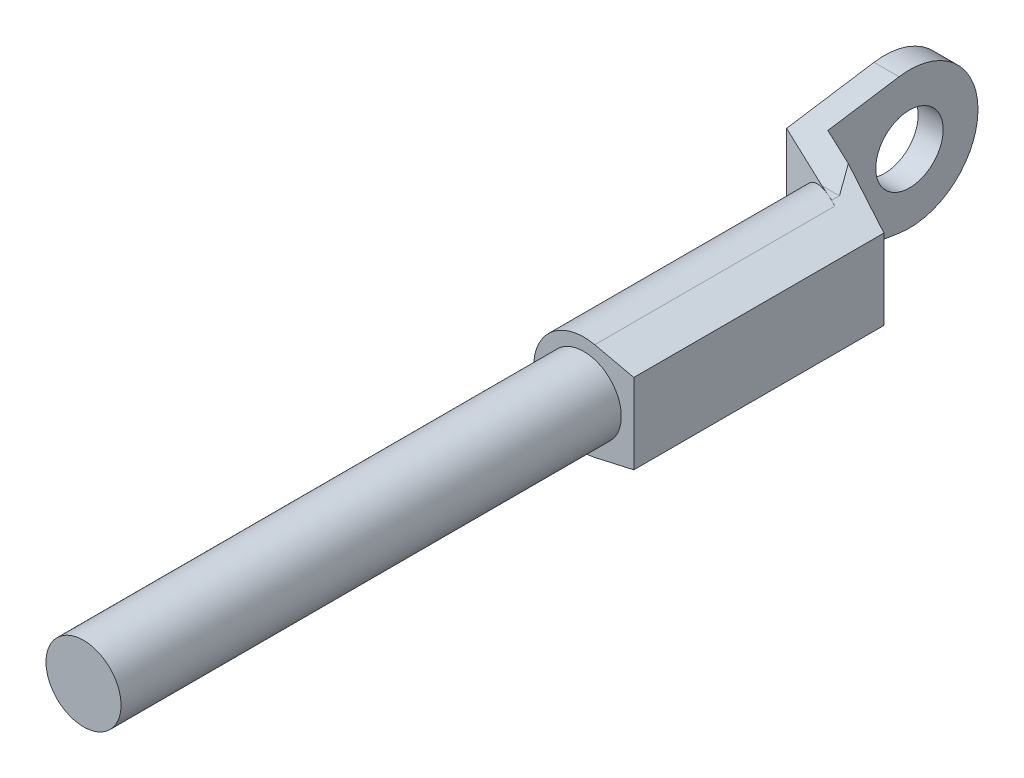
ISO-10303-21;
HEADER;
FILE_DESCRIPTION(('STEP AP214'),'2;1');
FILE_NAME('part.step','',(''),(''),'','','');
FILE_SCHEMA(('AUTOMOTIVE_DESIGN { 1 0 10303 214 1 1 1 1 }'));
ENDSEC;
DATA;
#1=APPLICATION_CONTEXT('core data for automotive mechanical design processes');
#2=APPLICATION_PROTOCOL_DEFINITION('international standard','automotive_design',2000,#1);
#3=PRODUCT_CONTEXT('',#1,'mechanical');
#4=PRODUCT('Part','Part','',(#3));
#5=PRODUCT_RELATED_PRODUCT_CATEGORY('part','',(#4));
#6=PRODUCT_DEFINITION_FORMATION('','',#4);
#7=PRODUCT_DEFINITION_CONTEXT('part definition',#1,'design');
#8=PRODUCT_DEFINITION('design','',#6,#7);
#9=PRODUCT_DEFINITION_SHAPE('','',#8);
#10=(LENGTH_UNIT() NAMED_UNIT(*) SI_UNIT(.MILLI.,.METRE.));
#11=(NAMED_UNIT(*) PLANE_ANGLE_UNIT() SI_UNIT($,.RADIAN.));
#12=(NAMED_UNIT(*) SI_UNIT($,.STERADIAN.) SOLID_ANGLE_UNIT());
#13=UNCERTAINTY_MEASURE_WITH_UNIT(LENGTH_MEASURE(1.E-05),#10,'distance_accuracy_value','');
#14=(GEOMETRIC_REPRESENTATION_CONTEXT(3) GLOBAL_UNCERTAINTY_ASSIGNED_CONTEXT((#13)) GLOBAL_UNIT_ASSIGNED_CONTEXT((#10,
#11,#12)) REPRESENTATION_CONTEXT('',''));
#15=CARTESIAN_POINT('',(0.,0.,0.));
#16=DIRECTION('',(0.,0.,1.));
#17=DIRECTION('',(1.,0.,0.));
#18=AXIS2_PLACEMENT_3D('',#15,#16,#17);
#19=CARTESIAN_POINT('',(501.65,38.1,0.));
#20=DIRECTION('',(-1.,0.,0.));
#21=DIRECTION('',(0.,0.,1.));
#22=AXIS2_PLACEMENT_3D('',#19,#20,#21);
#23=CYLINDRICAL_SURFACE('',#22,8.5598);
#24=CARTESIAN_POINT('',(476.25,38.1,0.));
#25=DIRECTION('',(-1.,0.,0.));
#26=DIRECTION('',(0.,0.,1.));
#27=AXIS2_PLACEMENT_3D('',#24,#25,#26);
#28=CIRCLE('',#27,8.5598);
#29=CARTESIAN_POINT('',(476.25,38.1,8.5598));
#30=VERTEX_POINT('',#29);
#31=EDGE_CURVE('E160',#30,#30,#28,.F.);
#32=ORIENTED_EDGE('',*,*,#31,.T.);
#33=EDGE_LOOP('',(#32));
#34=FACE_BOUND('',#33,.T.);
#35=CARTESIAN_POINT('',(469.9,38.1,0.));
#36=DIRECTION('',(-1.,0.,0.));
#37=DIRECTION('',(0.,0.,1.));
#38=AXIS2_PLACEMENT_3D('',#35,#36,#37);
#39=CIRCLE('',#38,8.5598);
#40=CARTESIAN_POINT('',(469.9,38.1,8.5598));
#41=VERTEX_POINT('',#40);
#42=EDGE_CURVE('E164',#41,#41,#39,.F.);
#43=ORIENTED_EDGE('',*,*,#42,.F.);
#44=EDGE_LOOP('',(#43));
#45=FACE_BOUND('',#44,.T.);
#46=ADVANCED_FACE('F17',(#34,#45),#23,.F.);
#47=CARTESIAN_POINT('',(469.9,38.1,0.));
#48=DIRECTION('',(-1.,0.,0.));
#49=DIRECTION('',(0.,0.,1.));
#50=AXIS2_PLACEMENT_3D('',#47,#48,#49);
#51=PLANE('',#50);
#52=CARTESIAN_POINT('',(469.9,38.1,0.));
#53=DIRECTION('',(1.,0.,0.));
#54=DIRECTION('',(0.,0.,-1.));
#55=AXIS2_PLACEMENT_3D('',#52,#53,#54);
#56=CIRCLE('',#55,17.399);
#57=CARTESIAN_POINT('',(469.9,20.903280810629,2.64538279307929));
#58=VERTEX_POINT('',#57);
#59=CARTESIAN_POINT('',(469.9,55.296719189371,2.64538279307928));
#60=VERTEX_POINT('',#59);
#61=EDGE_CURVE('E102',#58,#60,#56,.T.);
#62=ORIENTED_EDGE('',*,*,#61,.F.);
#63=DIRECTION('',(0.,0.152042231914437,0.988373997894763));
#64=VECTOR('',#63,1.);
#65=CARTESIAN_POINT('',(469.9,20.903280810629,2.64538279307929));
#66=LINE('',#65,#64);
#67=CARTESIAN_POINT('',(469.9,24.3181861600818,24.8445021441437));
#68=VERTEX_POINT('',#67);
#69=EDGE_CURVE('E98',#58,#68,#66,.T.);
#70=ORIENTED_EDGE('',*,*,#69,.T.);
#71=DIRECTION('',(0.,1.,0.));
#72=VECTOR('',#71,1.);
#73=CARTESIAN_POINT('',(469.9,38.1,24.8445021441437));
#74=LINE('',#73,#72);
#75=CARTESIAN_POINT('',(469.9,51.8818138399182,24.8445021441438));
#76=VERTEX_POINT('',#75);
#77=EDGE_CURVE('E78',#68,#76,#74,.T.);
#78=ORIENTED_EDGE('',*,*,#77,.T.);
#79=DIRECTION('',(0.,0.152042231914437,-0.988373997894763));
#80=VECTOR('',#79,1.);
#81=CARTESIAN_POINT('',(469.9,50.8,31.877));
#82=LINE('',#81,#80);
#83=EDGE_CURVE('E73',#76,#60,#82,.T.);
#84=ORIENTED_EDGE('',*,*,#83,.T.);
#85=EDGE_LOOP('',(#62,#70,#78,#84));
#86=FACE_BOUND('',#85,.T.);
#87=ORIENTED_EDGE('',*,*,#42,.T.);
#88=EDGE_LOOP('',(#87));
#89=FACE_BOUND('',#88,.T.);
#90=ADVANCED_FACE('F100',(#86,#89),#51,.T.);
#91=CARTESIAN_POINT('',(469.9,38.1,0.));
#92=DIRECTION('',(1.,0.,0.));
#93=DIRECTION('',(0.,0.,-1.));
#94=AXIS2_PLACEMENT_3D('',#91,#92,#93);
#95=CYLINDRICAL_SURFACE('',#94,17.399);
#96=DIRECTION('',(1.,0.,0.));
#97=VECTOR('',#96,1.);
#98=CARTESIAN_POINT('',(469.9,55.296719189371,2.64538279307928));
#99=LINE('',#98,#97);
#100=CARTESIAN_POINT('',(476.25,55.296719189371,2.64538279307928));
#101=VERTEX_POINT('',#100);
#102=EDGE_CURVE('E429',#60,#101,#99,.T.);
#103=ORIENTED_EDGE('',*,*,#102,.T.);
#104=CARTESIAN_POINT('',(476.25,38.1,0.));
#105=DIRECTION('',(1.,0.,0.));
#106=DIRECTION('',(0.,0.,-1.));
#107=AXIS2_PLACEMENT_3D('',#104,#105,#106);
#108=CIRCLE('',#107,17.399);
#109=CARTESIAN_POINT('',(476.25,20.903280810629,2.64538279307929));
#110=VERTEX_POINT('',#109);
#111=EDGE_CURVE('E135',#101,#110,#108,.F.);
#112=ORIENTED_EDGE('',*,*,#111,.T.);
#113=DIRECTION('',(1.,0.,0.));
#114=VECTOR('',#113,1.);
#115=CARTESIAN_POINT('',(469.9,20.903280810629,2.64538279307929));
#116=LINE('',#115,#114);
#117=EDGE_CURVE('E107',#110,#58,#116,.F.);
#118=ORIENTED_EDGE('',*,*,#117,.T.);
#119=ORIENTED_EDGE('',*,*,#61,.T.);
#120=EDGE_LOOP('',(#103,#112,#118,#119));
#121=FACE_BOUND('',#120,.T.);
#122=ADVANCED_FACE('F248',(#121),#95,.T.);
#123=CARTESIAN_POINT('',(476.25,12.7,-17.399));
#124=DIRECTION('',(-1.,0.,0.));
#125=DIRECTION('',(0.,0.,1.));
#126=AXIS2_PLACEMENT_3D('',#123,#124,#125);
#127=PLANE('',#126);
#128=DIRECTION('',(0.,0.152042231914437,-0.988373997894763));
#129=VECTOR('',#128,1.);
#130=CARTESIAN_POINT('',(476.25,50.8,31.877));
#131=LINE('',#130,#129);
#132=CARTESIAN_POINT('',(476.25,52.5192115408693,20.701));
#133=VERTEX_POINT('',#132);
#134=EDGE_CURVE('E432',#101,#133,#131,.F.);
#135=ORIENTED_EDGE('',*,*,#134,.T.);
#136=DIRECTION('',(0.,1.,0.));
#137=VECTOR('',#136,1.);
#138=CARTESIAN_POINT('',(476.25,12.7,20.701));
#139=LINE('',#138,#137);
#140=CARTESIAN_POINT('',(476.25,23.6807884591308,20.701));
#141=VERTEX_POINT('',#140);
#142=EDGE_CURVE('E122',#133,#141,#139,.F.);
#143=ORIENTED_EDGE('',*,*,#142,.T.);
#144=DIRECTION('',(0.,0.152042231914437,0.988373997894763));
#145=VECTOR('',#144,1.);
#146=CARTESIAN_POINT('',(476.25,20.903280810629,2.64538279307929));
#147=LINE('',#146,#145);
#148=EDGE_CURVE('E132',#141,#110,#147,.F.);
#149=ORIENTED_EDGE('',*,*,#148,.T.);
#150=ORIENTED_EDGE('',*,*,#111,.F.);
#151=EDGE_LOOP('',(#135,#143,#149,#150));
#152=FACE_BOUND('',#151,.T.);
#153=ORIENTED_EDGE('',*,*,#31,.F.);
#154=EDGE_LOOP('',(#153));
#155=FACE_BOUND('',#154,.T.);
#156=ADVANCED_FACE('F244',(#152,#155),#127,.F.);
#157=CARTESIAN_POINT('',(469.9,25.4,31.877));
#158=DIRECTION('',(0.,1.,0.));
#159=DIRECTION('',(0.,0.,1.));
#160=AXIS2_PLACEMENT_3D('',#157,#158,#159);
#161=PLANE('',#160);
#162=DIRECTION('',(0.,0.,1.));
#163=VECTOR('',#162,1.);
#164=CARTESIAN_POINT('',(490.361111111111,25.4,-17.9483393567897));
#165=LINE('',#164,#163);
#166=CARTESIAN_POINT('',(490.361111111111,25.4,33.8473910330326));
#167=VERTEX_POINT('',#166);
#168=CARTESIAN_POINT('',(490.361111111111,25.4,31.877));
#169=VERTEX_POINT('',#168);
#170=EDGE_CURVE('E524',#167,#169,#165,.F.);
#171=ORIENTED_EDGE('',*,*,#170,.F.);
#172=DIRECTION('',(-0.915315032422766,0.,-0.402738614266016));
#173=VECTOR('',#172,1.);
#174=CARTESIAN_POINT('',(487.341704973674,25.4,32.5188523325602));
#175=LINE('',#174,#173);
#176=CARTESIAN_POINT('',(488.95,25.4,33.2265021441437));
#177=VERTEX_POINT('',#176);
#178=EDGE_CURVE('E519',#167,#177,#175,.T.);
#179=ORIENTED_EDGE('',*,*,#178,.T.);
#180=DIRECTION('',(-0.915315032422766,0.,-0.402738614266016));
#181=VECTOR('',#180,1.);
#182=CARTESIAN_POINT('',(487.341704973674,25.4,32.5188523325602));
#183=LINE('',#182,#181);
#184=CARTESIAN_POINT('',(485.882949672401,25.4,31.8770000000001));
#185=VERTEX_POINT('',#184);
#186=EDGE_CURVE('E116',#177,#185,#183,.T.);
#187=ORIENTED_EDGE('',*,*,#186,.T.);
#188=DIRECTION('',(1.,0.,0.));
#189=VECTOR('',#188,1.);
#190=CARTESIAN_POINT('',(469.9,25.4,31.877));
#191=LINE('',#190,#189);
#192=EDGE_CURVE('E106',#185,#169,#191,.T.);
#193=ORIENTED_EDGE('',*,*,#192,.T.);
#194=EDGE_LOOP('',(#171,#179,#187,#193));
#195=FACE_BOUND('',#194,.T.);
#196=ADVANCED_FACE('F241',(#195),#161,.F.);
#197=CARTESIAN_POINT('',(469.9,20.903280810629,2.64538279307929));
#198=DIRECTION('',(0.,0.988373997894763,-0.152042231914437));
#199=DIRECTION('',(0.,0.152042231914437,0.988373997894763));
#200=AXIS2_PLACEMENT_3D('',#197,#198,#199);
#201=PLANE('',#200);
#202=DIRECTION('',(-0.55989585254643,-0.125976566822947,-0.818930118455054));
#203=VECTOR('',#202,1.);
#204=CARTESIAN_POINT('',(490.361111111111,25.4,31.877));
#205=LINE('',#204,#203);
#206=CARTESIAN_POINT('',(485.504000115403,24.3071500259656,24.7727600507772));
#207=VERTEX_POINT('',#206);
#208=EDGE_CURVE('E533',#169,#207,#205,.T.);
#209=ORIENTED_EDGE('',*,*,#208,.F.);
#210=ORIENTED_EDGE('',*,*,#192,.F.);
#211=DIRECTION('',(-0.913563472538673,-0.061834994697046,-0.401967927917015));
#212=VECTOR('',#211,1.);
#213=CARTESIAN_POINT('',(485.882949672401,25.4,31.8770000000001));
#214=LINE('',#213,#212);
#215=EDGE_CURVE('E111',#185,#68,#214,.T.);
#216=ORIENTED_EDGE('',*,*,#215,.T.);
#217=ORIENTED_EDGE('',*,*,#69,.F.);
#218=ORIENTED_EDGE('',*,*,#117,.F.);
#219=ORIENTED_EDGE('',*,*,#148,.F.);
#220=DIRECTION('',(0.913563472538673,0.0618349946970416,0.401967927917015));
#221=VECTOR('',#220,1.);
#222=CARTESIAN_POINT('',(476.25,23.6807884591308,20.701));
#223=LINE('',#222,#221);
#224=EDGE_CURVE('E124',#141,#207,#223,.T.);
#225=ORIENTED_EDGE('',*,*,#224,.T.);
#226=EDGE_LOOP('',(#209,#210,#216,#217,#218,#219,#225));
#227=FACE_BOUND('',#226,.T.);
#228=ADVANCED_FACE('F113',(#227),#201,.F.);
#229=CARTESIAN_POINT('',(487.341704973674,38.1,32.5188523325602));
#230=DIRECTION('',(0.402738614266016,0.,-0.915315032422766));
#231=DIRECTION('',(-0.915315032422766,0.,-0.402738614266016));
#232=AXIS2_PLACEMENT_3D('',#229,#230,#231);
#233=PLANE('',#232);
#234=DIRECTION('',(-0.896500504615088,-0.201712613538394,-0.394460222030565));
#235=VECTOR('',#234,1.);
#236=CARTESIAN_POINT('',(491.737804878049,25.709756097561,34.4531362904853));
#237=LINE('',#236,#235);
#238=CARTESIAN_POINT('',(491.737804878049,25.709756097561,34.4531362904852));
#239=VERTEX_POINT('',#238);
#240=EDGE_CURVE('E509',#239,#167,#237,.T.);
#241=ORIENTED_EDGE('',*,*,#240,.F.);
#242=CARTESIAN_POINT('',(488.95,38.1,33.2265021441436));
#243=DIRECTION('',(0.402738614266016,0.,-0.915315032422766));
#244=DIRECTION('',(0.915315032422766,0.,0.402738614266016));
#245=AXIS2_PLACEMENT_3D('',#242,#243,#244);
#246=ELLIPSE('',#245,13.8750042882876,12.7);
#247=EDGE_CURVE('E155',#177,#239,#246,.F.);
#248=ORIENTED_EDGE('',*,*,#247,.F.);
#249=ORIENTED_EDGE('',*,*,#178,.F.);
#250=EDGE_LOOP('',(#241,#248,#249));
#251=FACE_BOUND('',#250,.T.);
#252=ADVANCED_FACE('F234',(#251),#233,.F.);
#253=CARTESIAN_POINT('',(487.341704973674,38.1,32.5188523325602));
#254=DIRECTION('',(0.402738614266016,0.,-0.915315032422766));
#255=DIRECTION('',(-0.915315032422766,0.,-0.402738614266016));
#256=AXIS2_PLACEMENT_3D('',#253,#254,#255);
#257=PLANE('',#256);
#258=DIRECTION('',(0.89650050461507,-0.201712613538356,0.394460222030625));
#259=VECTOR('',#258,1.);
#260=CARTESIAN_POINT('',(490.361111111111,50.8,33.8473910330325));
#261=LINE('',#260,#259);
#262=CARTESIAN_POINT('',(490.361111111111,50.8,33.8473910330326));
#263=VERTEX_POINT('',#262);
#264=CARTESIAN_POINT('',(491.737804878049,50.4902439024391,34.4531362904851));
#265=VERTEX_POINT('',#264);
#266=EDGE_CURVE('E515',#263,#265,#261,.T.);
#267=ORIENTED_EDGE('',*,*,#266,.F.);
#268=DIRECTION('',(-0.915315032422754,0.,-0.402738614266042));
#269=VECTOR('',#268,1.);
#270=CARTESIAN_POINT('',(490.361111111111,50.8,33.8473910330327));
#271=LINE('',#270,#269);
#272=CARTESIAN_POINT('',(488.95,50.8,33.2265021441437));
#273=VERTEX_POINT('',#272);
#274=EDGE_CURVE('E462',#263,#273,#271,.T.);
#275=ORIENTED_EDGE('',*,*,#274,.T.);
#276=CARTESIAN_POINT('',(488.95,38.1,33.2265021441436));
#277=DIRECTION('',(0.402738614266016,0.,-0.915315032422766));
#278=DIRECTION('',(0.915315032422766,0.,0.402738614266016));
#279=AXIS2_PLACEMENT_3D('',#276,#277,#278);
#280=ELLIPSE('',#279,13.8750042882876,12.7);
#281=EDGE_CURVE('E151',#265,#273,#280,.F.);
#282=ORIENTED_EDGE('',*,*,#281,.F.);
#283=EDGE_LOOP('',(#267,#275,#282));
#284=FACE_BOUND('',#283,.T.);
#285=ADVANCED_FACE('F231',(#284),#257,.F.);
#286=CARTESIAN_POINT('',(487.341704973674,38.1,32.5188523325602));
#287=DIRECTION('',(0.402738614266016,0.,-0.915315032422766));
#288=DIRECTION('',(-0.915315032422766,0.,-0.402738614266016));
#289=AXIS2_PLACEMENT_3D('',#286,#287,#288);
#290=PLANE('',#289);
#291=ORIENTED_EDGE('',*,*,#77,.F.);
#292=ORIENTED_EDGE('',*,*,#215,.F.);
#293=ORIENTED_EDGE('',*,*,#186,.F.);
#294=CARTESIAN_POINT('',(488.95,38.1,33.2265021441436));
#295=DIRECTION('',(0.402738614266016,0.,-0.915315032422766));
#296=DIRECTION('',(0.915315032422766,0.,0.402738614266016));
#297=AXIS2_PLACEMENT_3D('',#294,#295,#296);
#298=ELLIPSE('',#297,13.8750042882876,12.7);
#299=EDGE_CURVE('E148',#273,#177,#298,.F.);
#300=ORIENTED_EDGE('',*,*,#299,.F.);
#301=DIRECTION('',(-0.915315032422741,0.,-0.402738614266074));
#302=VECTOR('',#301,1.);
#303=CARTESIAN_POINT('',(488.95,50.8,33.2265021441438));
#304=LINE('',#303,#302);
#305=CARTESIAN_POINT('',(485.882949672401,50.8,31.877));
#306=VERTEX_POINT('',#305);
#307=EDGE_CURVE('E442',#273,#306,#304,.T.);
#308=ORIENTED_EDGE('',*,*,#307,.T.);
#309=DIRECTION('',(-0.913563472538677,0.0618349946970481,-0.401967927917004));
#310=VECTOR('',#309,1.);
#311=CARTESIAN_POINT('',(485.882949672401,50.8,31.877));
#312=LINE('',#311,#310);
#313=EDGE_CURVE('E121',#306,#76,#312,.T.);
#314=ORIENTED_EDGE('',*,*,#313,.T.);
#315=EDGE_LOOP('',(#291,#292,#293,#300,#308,#314));
#316=FACE_BOUND('',#315,.T.);
#317=ADVANCED_FACE('F118',(#316),#290,.F.);
#318=CARTESIAN_POINT('',(476.25,12.7,20.701));
#319=DIRECTION('',(-0.402738614266016,0.,0.915315032422766));
#320=DIRECTION('',(0.915315032422766,0.,0.402738614266016));
#321=AXIS2_PLACEMENT_3D('',#318,#319,#320);
#322=PLANE('',#321);
#323=DIRECTION('',(0.89650050461506,0.201712613538388,0.394460222030633));
#324=VECTOR('',#323,1.);
#325=CARTESIAN_POINT('',(485.504000115403,24.3071500259657,24.7727600507772));
#326=LINE('',#325,#324);
#327=CARTESIAN_POINT('',(501.65,27.94,31.877));
#328=VERTEX_POINT('',#327);
#329=EDGE_CURVE('E504',#207,#328,#326,.T.);
#330=ORIENTED_EDGE('',*,*,#329,.F.);
#331=ORIENTED_EDGE('',*,*,#224,.F.);
#332=ORIENTED_EDGE('',*,*,#142,.F.);
#333=DIRECTION('',(0.913563472538677,-0.0618349946970484,0.401967927917005));
#334=VECTOR('',#333,1.);
#335=CARTESIAN_POINT('',(476.25,52.5192115408692,20.701));
#336=LINE('',#335,#334);
#337=CARTESIAN_POINT('',(485.504000115403,51.8928499740344,24.7727600507772));
#338=VERTEX_POINT('',#337);
#339=EDGE_CURVE('E440',#133,#338,#336,.T.);
#340=ORIENTED_EDGE('',*,*,#339,.T.);
#341=DIRECTION('',(-0.89650050461506,0.201712613538388,-0.394460222030633));
#342=VECTOR('',#341,1.);
#343=CARTESIAN_POINT('',(501.65,48.26,31.877));
#344=LINE('',#343,#342);
#345=CARTESIAN_POINT('',(501.65,48.26,31.877));
#346=VERTEX_POINT('',#345);
#347=EDGE_CURVE('E485',#346,#338,#344,.T.);
#348=ORIENTED_EDGE('',*,*,#347,.F.);
#349=DIRECTION('',(0.,1.,0.));
#350=VECTOR('',#349,1.);
#351=CARTESIAN_POINT('',(501.65,38.1,31.877));
#352=LINE('',#351,#350);
#353=EDGE_CURVE('E466',#346,#328,#352,.F.);
#354=ORIENTED_EDGE('',*,*,#353,.T.);
#355=EDGE_LOOP('',(#330,#331,#332,#340,#348,#354));
#356=FACE_BOUND('',#355,.T.);
#357=ADVANCED_FACE('F224',(#356),#322,.F.);
#358=CARTESIAN_POINT('',(469.9,50.8,31.877));
#359=DIRECTION('',(0.,-0.988373997894763,-0.152042231914437));
#360=DIRECTION('',(0.,0.152042231914437,-0.988373997894763));
#361=AXIS2_PLACEMENT_3D('',#358,#359,#360);
#362=PLANE('',#361);
#363=DIRECTION('',(0.55989585254643,-0.125976566822946,0.818930118455055));
#364=VECTOR('',#363,1.);
#365=CARTESIAN_POINT('',(485.504000115403,51.8928499740343,24.7727600507772));
#366=LINE('',#365,#364);
#367=CARTESIAN_POINT('',(490.361111111111,50.8,31.877));
#368=VERTEX_POINT('',#367);
#369=EDGE_CURVE('E481',#338,#368,#366,.T.);
#370=ORIENTED_EDGE('',*,*,#369,.F.);
#371=ORIENTED_EDGE('',*,*,#339,.F.);
#372=ORIENTED_EDGE('',*,*,#134,.F.);
#373=ORIENTED_EDGE('',*,*,#102,.F.);
#374=ORIENTED_EDGE('',*,*,#83,.F.);
#375=ORIENTED_EDGE('',*,*,#313,.F.);
#376=DIRECTION('',(1.,0.,0.));
#377=VECTOR('',#376,1.);
#378=CARTESIAN_POINT('',(469.9,50.8,31.877));
#379=LINE('',#378,#377);
#380=EDGE_CURVE('E460',#306,#368,#379,.T.);
#381=ORIENTED_EDGE('',*,*,#380,.T.);
#382=EDGE_LOOP('',(#370,#371,#372,#373,#374,#375,#381));
#383=FACE_BOUND('',#382,.T.);
#384=ADVANCED_FACE('F220',(#383),#362,.F.);
#385=CARTESIAN_POINT('',(469.9,50.8,95.377));
#386=DIRECTION('',(0.,-1.,0.));
#387=DIRECTION('',(0.,0.,-1.));
#388=AXIS2_PLACEMENT_3D('',#385,#386,#387);
#389=PLANE('',#388);
#390=DIRECTION('',(0.,0.,1.));
#391=VECTOR('',#390,1.);
#392=CARTESIAN_POINT('',(490.361111111111,50.8000000000001,-17.9483393567897));
#393=LINE('',#392,#391);
#394=EDGE_CURVE('E478',#368,#263,#393,.T.);
#395=ORIENTED_EDGE('',*,*,#394,.F.);
#396=ORIENTED_EDGE('',*,*,#380,.F.);
#397=ORIENTED_EDGE('',*,*,#307,.F.);
#398=ORIENTED_EDGE('',*,*,#274,.F.);
#399=EDGE_LOOP('',(#395,#396,#397,#398));
#400=FACE_BOUND('',#399,.T.);
#401=ADVANCED_FACE('F216',(#400),#389,.F.);
#402=CARTESIAN_POINT('',(501.65,38.1,0.));
#403=DIRECTION('',(-1.,0.,0.));
#404=DIRECTION('',(0.,0.,1.));
#405=AXIS2_PLACEMENT_3D('',#402,#403,#404);
#406=PLANE('',#405);
#407=ORIENTED_EDGE('',*,*,#353,.F.);
#408=DIRECTION('',(0.,0.,1.));
#409=VECTOR('',#408,1.);
#410=CARTESIAN_POINT('',(501.65,48.26,-17.9483393567897));
#411=LINE('',#410,#409);
#412=CARTESIAN_POINT('',(501.65,48.26,95.377));
#413=VERTEX_POINT('',#412);
#414=EDGE_CURVE('E150',#413,#346,#411,.F.);
#415=ORIENTED_EDGE('',*,*,#414,.F.);
#416=DIRECTION('',(0.,1.,0.));
#417=VECTOR('',#416,1.);
#418=CARTESIAN_POINT('',(501.65,25.4,95.377));
#419=LINE('',#418,#417);
#420=CARTESIAN_POINT('',(501.65,27.94,95.377));
#421=VERTEX_POINT('',#420);
#422=EDGE_CURVE('E483',#413,#421,#419,.F.);
#423=ORIENTED_EDGE('',*,*,#422,.T.);
#424=DIRECTION('',(0.,0.,1.));
#425=VECTOR('',#424,1.);
#426=CARTESIAN_POINT('',(501.65,27.94,-17.9483393567897));
#427=LINE('',#426,#425);
#428=EDGE_CURVE('E158',#328,#421,#427,.T.);
#429=ORIENTED_EDGE('',*,*,#428,.F.);
#430=EDGE_LOOP('',(#407,#415,#423,#429));
#431=FACE_BOUND('',#430,.T.);
#432=ADVANCED_FACE('F212',(#431),#406,.F.);
#433=CARTESIAN_POINT('',(501.65,27.94,-17.9483393567897));
#434=DIRECTION('',(0.219512195121951,-0.975609756097561,0.));
#435=DIRECTION('',(0.975609756097561,0.219512195121951,0.));
#436=AXIS2_PLACEMENT_3D('',#433,#434,#435);
#437=PLANE('',#436);
#438=ORIENTED_EDGE('',*,*,#428,.T.);
#439=DIRECTION('',(-0.975609756097561,-0.219512195121953,0.));
#440=VECTOR('',#439,1.);
#441=CARTESIAN_POINT('',(501.65,27.94,95.377));
#442=LINE('',#441,#440);
#443=CARTESIAN_POINT('',(491.737804878049,25.709756097561,95.377));
#444=VERTEX_POINT('',#443);
#445=EDGE_CURVE('E147',#421,#444,#442,.T.);
#446=ORIENTED_EDGE('',*,*,#445,.T.);
#447=DIRECTION('',(0.,0.,1.));
#448=VECTOR('',#447,1.);
#449=CARTESIAN_POINT('',(491.737804878049,25.709756097561,-17.9483393567897));
#450=LINE('',#449,#448);
#451=EDGE_CURVE('E154',#239,#444,#450,.T.);
#452=ORIENTED_EDGE('',*,*,#451,.F.);
#453=ORIENTED_EDGE('',*,*,#240,.T.);
#454=ORIENTED_EDGE('',*,*,#170,.T.);
#455=ORIENTED_EDGE('',*,*,#208,.T.);
#456=ORIENTED_EDGE('',*,*,#329,.T.);
#457=EDGE_LOOP('',(#438,#446,#452,#453,#454,#455,#456));
#458=FACE_BOUND('',#457,.T.);
#459=ADVANCED_FACE('F209',(#458),#437,.T.);
#460=CARTESIAN_POINT('',(488.95,38.1,-17.9483393567897));
#461=DIRECTION('',(0.,0.,1.));
#462=DIRECTION('',(1.,0.,0.));
#463=AXIS2_PLACEMENT_3D('',#460,#461,#462);
#464=CYLINDRICAL_SURFACE('',#463,12.7);
#465=ORIENTED_EDGE('',*,*,#281,.T.);
#466=ORIENTED_EDGE('',*,*,#299,.T.);
#467=ORIENTED_EDGE('',*,*,#247,.T.);
#468=ORIENTED_EDGE('',*,*,#451,.T.);
#469=CARTESIAN_POINT('',(488.95,38.1,95.377));
#470=DIRECTION('',(0.,0.,1.));
#471=DIRECTION('',(1.,0.,0.));
#472=AXIS2_PLACEMENT_3D('',#469,#470,#471);
#473=CIRCLE('',#472,12.7);
#474=CARTESIAN_POINT('',(491.737804878049,50.490243902439,95.377));
#475=VERTEX_POINT('',#474);
#476=EDGE_CURVE('E35',#444,#475,#473,.F.);
#477=ORIENTED_EDGE('',*,*,#476,.T.);
#478=DIRECTION('',(0.,0.,1.));
#479=VECTOR('',#478,1.);
#480=CARTESIAN_POINT('',(491.737804878049,50.490243902439,-17.9483393567897));
#481=LINE('',#480,#479);
#482=EDGE_CURVE('E480',#265,#475,#481,.T.);
#483=ORIENTED_EDGE('',*,*,#482,.F.);
#484=EDGE_LOOP('',(#465,#466,#467,#468,#477,#483));
#485=FACE_BOUND('',#484,.T.);
#486=ADVANCED_FACE('F205',(#485),#464,.T.);
#487=CARTESIAN_POINT('',(491.737804878049,50.490243902439,-17.9483393567897));
#488=DIRECTION('',(0.219512195121951,0.975609756097561,0.));
#489=DIRECTION('',(-0.975609756097561,0.219512195121951,0.));
#490=AXIS2_PLACEMENT_3D('',#487,#488,#489);
#491=PLANE('',#490);
#492=ORIENTED_EDGE('',*,*,#482,.T.);
#493=DIRECTION('',(0.97560975609756,-0.219512195121954,0.));
#494=VECTOR('',#493,1.);
#495=CARTESIAN_POINT('',(491.737804878049,50.490243902439,95.377));
#496=LINE('',#495,#494);
#497=EDGE_CURVE('E145',#475,#413,#496,.T.);
#498=ORIENTED_EDGE('',*,*,#497,.T.);
#499=ORIENTED_EDGE('',*,*,#414,.T.);
#500=ORIENTED_EDGE('',*,*,#347,.T.);
#501=ORIENTED_EDGE('',*,*,#369,.T.);
#502=ORIENTED_EDGE('',*,*,#394,.T.);
#503=ORIENTED_EDGE('',*,*,#266,.T.);
#504=EDGE_LOOP('',(#492,#498,#499,#500,#501,#502,#503));
#505=FACE_BOUND('',#504,.T.);
#506=ADVANCED_FACE('F201',(#505),#491,.T.);
#507=CARTESIAN_POINT('',(488.95,38.1,222.377));
#508=DIRECTION('',(0.,0.,1.));
#509=DIRECTION('',(1.,0.,0.));
#510=AXIS2_PLACEMENT_3D('',#507,#508,#509);
#511=PLANE('',#510);
#512=CARTESIAN_POINT('',(488.95,38.1,222.377));
#513=DIRECTION('',(0.,0.,-1.));
#514=DIRECTION('',(-1.,0.,0.));
#515=AXIS2_PLACEMENT_3D('',#512,#513,#514);
#516=CIRCLE('',#515,9.525);
#517=CARTESIAN_POINT('',(479.425,38.1,222.377));
#518=VERTEX_POINT('',#517);
#519=EDGE_CURVE('E26',#518,#518,#516,.T.);
#520=ORIENTED_EDGE('',*,*,#519,.F.);
#521=EDGE_LOOP('',(#520));
#522=FACE_BOUND('',#521,.T.);
#523=ADVANCED_FACE('F197',(#522),#511,.T.);
#524=CARTESIAN_POINT('',(469.9,25.4,95.377));
#525=DIRECTION('',(0.,0.,-1.));
#526=DIRECTION('',(-1.,0.,0.));
#527=AXIS2_PLACEMENT_3D('',#524,#525,#526);
#528=PLANE('',#527);
#529=CARTESIAN_POINT('',(488.95,38.1,95.377));
#530=DIRECTION('',(0.,0.,-1.));
#531=DIRECTION('',(-1.,0.,0.));
#532=AXIS2_PLACEMENT_3D('',#529,#530,#531);
#533=CIRCLE('',#532,9.525);
#534=CARTESIAN_POINT('',(479.425,38.1,95.377));
#535=VERTEX_POINT('',#534);
#536=EDGE_CURVE('E11',#535,#535,#533,.F.);
#537=ORIENTED_EDGE('',*,*,#536,.F.);
#538=EDGE_LOOP('',(#537));
#539=FACE_BOUND('',#538,.T.);
#540=ORIENTED_EDGE('',*,*,#476,.F.);
#541=ORIENTED_EDGE('',*,*,#445,.F.);
#542=ORIENTED_EDGE('',*,*,#422,.F.);
#543=ORIENTED_EDGE('',*,*,#497,.F.);
#544=EDGE_LOOP('',(#540,#541,#542,#543));
#545=FACE_BOUND('',#544,.T.);
#546=ADVANCED_FACE('F193',(#539,#545),#528,.F.);
#547=CARTESIAN_POINT('',(488.95,38.1,222.377));
#548=DIRECTION('',(0.,0.,-1.));
#549=DIRECTION('',(-1.,0.,0.));
#550=AXIS2_PLACEMENT_3D('',#547,#548,#549);
#551=CYLINDRICAL_SURFACE('',#550,9.525);
#552=ORIENTED_EDGE('',*,*,#536,.T.);
#553=EDGE_LOOP('',(#552));
#554=FACE_BOUND('',#553,.T.);
#555=ORIENTED_EDGE('',*,*,#519,.T.);
#556=EDGE_LOOP('',(#555));
#557=FACE_BOUND('',#556,.T.);
#558=ADVANCED_FACE('F190',(#554,#557),#551,.T.);
#559=CLOSED_SHELL('',(#46,#90,#122,#156,#196,#228,#252,#285,#317,#357,#384,#401,#432,#459,#486,
#506,#523,#546,#558));
#560=CARTESIAN_POINT('',(488.95,38.1,95.377));
#561=DIRECTION('',(0.,0.,1.));
#562=DIRECTION('',(1.,0.,0.));
#563=AXIS2_PLACEMENT_3D('',#560,#561,#562);
#564=PLANE('',#563);
#565=CARTESIAN_POINT('',(488.95,38.1,95.377));
#566=DIRECTION('',(0.,0.,1.));
#567=DIRECTION('',(1.,0.,0.));
#568=AXIS2_PLACEMENT_3D('',#565,#566,#567);
#569=CIRCLE('',#568,8.255);
#570=CARTESIAN_POINT('',(497.205,38.1,95.377));
#571=VERTEX_POINT('',#570);
#572=EDGE_CURVE('E20',#571,#571,#569,.F.);
#573=ORIENTED_EDGE('',*,*,#572,.T.);
#574=EDGE_LOOP('',(#573));
#575=FACE_BOUND('',#574,.T.);
#576=ADVANCED_FACE('F173',(#575),#564,.F.);
#577=CARTESIAN_POINT('',(488.95,38.1,35.052));
#578=DIRECTION('',(0.,0.,1.));
#579=DIRECTION('',(1.,0.,0.));
#580=AXIS2_PLACEMENT_3D('',#577,#578,#579);
#581=CYLINDRICAL_SURFACE('',#580,8.255);
#582=ORIENTED_EDGE('',*,*,#572,.F.);
#583=EDGE_LOOP('',(#582));
#584=FACE_BOUND('',#583,.T.);
#585=CARTESIAN_POINT('',(488.95,38.1,35.052));
#586=DIRECTION('',(0.,0.,1.));
#587=DIRECTION('',(1.,0.,0.));
#588=AXIS2_PLACEMENT_3D('',#585,#586,#587);
#589=CIRCLE('',#588,8.255);
#590=CARTESIAN_POINT('',(497.205,38.1,35.052));
#591=VERTEX_POINT('',#590);
#592=EDGE_CURVE('E166',#591,#591,#589,.T.);
#593=ORIENTED_EDGE('',*,*,#592,.F.);
#594=EDGE_LOOP('',(#593));
#595=FACE_BOUND('',#594,.T.);
#596=ADVANCED_FACE('F175',(#584,#595),#581,.F.);
#597=CARTESIAN_POINT('',(488.95,38.1,35.052));
#598=DIRECTION('',(0.,0.,1.));
#599=DIRECTION('',(1.,0.,0.));
#600=AXIS2_PLACEMENT_3D('',#597,#598,#599);
#601=PLANE('',#600);
#602=ORIENTED_EDGE('',*,*,#592,.T.);
#603=EDGE_LOOP('',(#602));
#604=FACE_BOUND('',#603,.T.);
#605=ADVANCED_FACE('F178',(#604),#601,.T.);
#606=CLOSED_SHELL('',(#576,#596,#605));
#607=ORIENTED_CLOSED_SHELL('',*,#606,.T.);
#608=BREP_WITH_VOIDS('B1',#559,(#607));
#609=ADVANCED_BREP_SHAPE_REPRESENTATION('',(#18,#608),#14);
#610=SHAPE_DEFINITION_REPRESENTATION(#9,#609);
ENDSEC;
END-ISO-10303-21;
